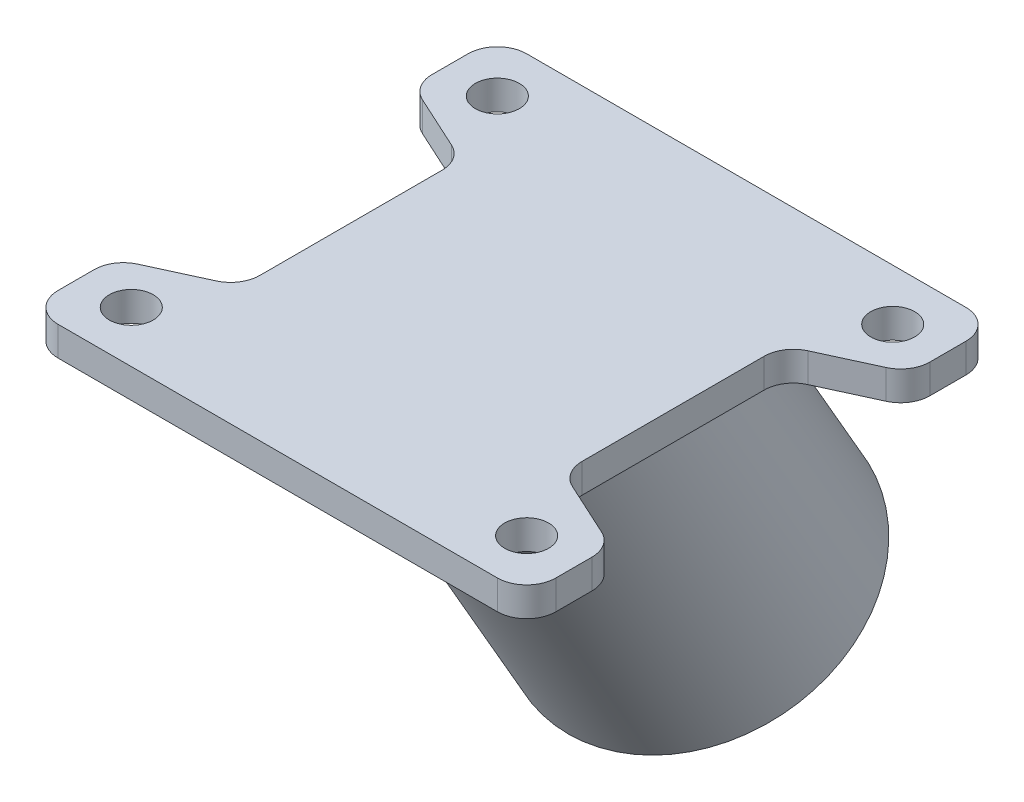
ISO-10303-21;
HEADER;
FILE_DESCRIPTION(('STEP AP214'),'2;1');
FILE_NAME('part.step','',(''),(''),'','','');
FILE_SCHEMA(('AUTOMOTIVE_DESIGN { 1 0 10303 214 1 1 1 1 }'));
ENDSEC;
DATA;
#1=APPLICATION_CONTEXT('core data for automotive mechanical design processes');
#2=APPLICATION_PROTOCOL_DEFINITION('international standard','automotive_design',2000,#1);
#3=PRODUCT_CONTEXT('',#1,'mechanical');
#4=PRODUCT('Part','Part','',(#3));
#5=PRODUCT_RELATED_PRODUCT_CATEGORY('part','',(#4));
#6=PRODUCT_DEFINITION_FORMATION('','',#4);
#7=PRODUCT_DEFINITION_CONTEXT('part definition',#1,'design');
#8=PRODUCT_DEFINITION('design','',#6,#7);
#9=PRODUCT_DEFINITION_SHAPE('','',#8);
#10=(LENGTH_UNIT() NAMED_UNIT(*) SI_UNIT(.MILLI.,.METRE.));
#11=(NAMED_UNIT(*) PLANE_ANGLE_UNIT() SI_UNIT($,.RADIAN.));
#12=(NAMED_UNIT(*) SI_UNIT($,.STERADIAN.) SOLID_ANGLE_UNIT());
#13=UNCERTAINTY_MEASURE_WITH_UNIT(LENGTH_MEASURE(1.E-05),#10,'distance_accuracy_value','');
#14=(GEOMETRIC_REPRESENTATION_CONTEXT(3) GLOBAL_UNCERTAINTY_ASSIGNED_CONTEXT((#13)) GLOBAL_UNIT_ASSIGNED_CONTEXT((#10,
#11,#12)) REPRESENTATION_CONTEXT('',''));
#15=CARTESIAN_POINT('',(0.,0.,0.));
#16=DIRECTION('',(0.,0.,1.));
#17=DIRECTION('',(1.,0.,0.));
#18=AXIS2_PLACEMENT_3D('',#15,#16,#17);
#19=CARTESIAN_POINT('',(-8.096,0.,8.19375502));
#20=DIRECTION('',(0.,-1.,0.));
#21=DIRECTION('',(0.,0.,-1.));
#22=AXIS2_PLACEMENT_3D('',#19,#20,#21);
#23=PLANE('',#22);
#24=CARTESIAN_POINT('',(0.,0.,-1.15470053859501));
#25=DIRECTION('',(0.,-1.,0.));
#26=DIRECTION('',(0.,0.,-1.));
#27=AXIS2_PLACEMENT_3D('',#24,#25,#26);
#28=ELLIPSE('',#27,9.23760430686141,7.99999999985182);
#29=CARTESIAN_POINT('',(0.,0.,-10.3923048454564));
#30=VERTEX_POINT('',#29);
#31=EDGE_CURVE('E20',#30,#30,#28,.T.);
#32=ORIENTED_EDGE('',*,*,#31,.T.);
#33=EDGE_LOOP('',(#32));
#34=FACE_BOUND('',#33,.T.);
#35=ADVANCED_FACE('F17',(#34),#23,.T.);
#36=CARTESIAN_POINT('',(0.,4.14190381084333,1.23662874155137));
#37=DIRECTION('',(0.,-0.866025403784579,-0.499999999999757));
#38=DIRECTION('',(0.,0.499999999999757,-0.866025403784579));
#39=AXIS2_PLACEMENT_3D('',#36,#37,#38);
#40=CYLINDRICAL_SURFACE('',#39,7.99999999985182);
#41=ORIENTED_EDGE('',*,*,#31,.F.);
#42=EDGE_LOOP('',(#41));
#43=FACE_BOUND('',#42,.T.);
#44=CARTESIAN_POINT('',(0.,-19.6506350946913,-12.5000000002548));
#45=DIRECTION('',(0.,-0.866025403784579,-0.499999999999757));
#46=DIRECTION('',(0.,0.499999999999757,-0.866025403784579));
#47=AXIS2_PLACEMENT_3D('',#44,#45,#46);
#48=CIRCLE('',#47,7.99999999985182);
#49=CARTESIAN_POINT('',(0.,-15.6506350947673,-19.4282032304031));
#50=VERTEX_POINT('',#49);
#51=EDGE_CURVE('E350',#50,#50,#48,.T.);
#52=ORIENTED_EDGE('',*,*,#51,.T.);
#53=EDGE_LOOP('',(#52));
#54=FACE_BOUND('',#53,.T.);
#55=ADVANCED_FACE('F358',(#43,#54),#40,.F.);
#56=CARTESIAN_POINT('',(-10.12,-14.590635095,-21.264177086));
#57=DIRECTION('',(0.,0.866025403777064,0.500000000012773));
#58=DIRECTION('',(0.,-0.500000000012773,0.866025403777064));
#59=AXIS2_PLACEMENT_3D('',#56,#57,#58);
#60=PLANE('',#59);
#61=CARTESIAN_POINT('',(0.,-19.6506350948775,-12.5000000003623));
#62=DIRECTION('',(0.,-0.866025403784579,-0.499999999999757));
#63=DIRECTION('',(0.,0.499999999999757,-0.866025403784579));
#64=AXIS2_PLACEMENT_3D('',#61,#62,#63);
#65=CIRCLE('',#64,9.99999999970747);
#66=CARTESIAN_POINT('',(0.,-14.6506350950262,-21.1602540379547));
#67=VERTEX_POINT('',#66);
#68=EDGE_CURVE('E348',#67,#67,#65,.F.);
#69=ORIENTED_EDGE('',*,*,#68,.F.);
#70=EDGE_LOOP('',(#69));
#71=FACE_BOUND('',#70,.T.);
#72=ORIENTED_EDGE('',*,*,#51,.F.);
#73=EDGE_LOOP('',(#72));
#74=FACE_BOUND('',#73,.T.);
#75=ADVANCED_FACE('F360',(#71,#74),#60,.F.);
#76=CARTESIAN_POINT('',(0.,5.14790381117485,1.81744311254716));
#77=DIRECTION('',(0.,-0.866025403784579,-0.499999999999757));
#78=DIRECTION('',(0.,0.499999999999757,-0.866025403784579));
#79=AXIS2_PLACEMENT_3D('',#76,#77,#78);
#80=CYLINDRICAL_SURFACE('',#79,9.99999999970747);
#81=ORIENTED_EDGE('',*,*,#68,.T.);
#82=EDGE_LOOP('',(#81));
#83=FACE_BOUND('',#82,.T.);
#84=CARTESIAN_POINT('',(0.,0.,-1.15470053859501));
#85=DIRECTION('',(0.,-1.,0.));
#86=DIRECTION('',(0.,0.,-1.));
#87=AXIS2_PLACEMENT_3D('',#84,#85,#86);
#88=ELLIPSE('',#87,11.5470053834529,9.99999999970747);
#89=CARTESIAN_POINT('',(0.,0.,-12.7017059220479));
#90=VERTEX_POINT('',#89);
#91=EDGE_CURVE('E345',#90,#90,#88,.F.);
#92=ORIENTED_EDGE('',*,*,#91,.F.);
#93=EDGE_LOOP('',(#92));
#94=FACE_BOUND('',#93,.T.);
#95=ADVANCED_FACE('F366',(#83,#94),#80,.T.);
#96=CARTESIAN_POINT('',(-17.,0.,16.));
#97=DIRECTION('',(0.,-1.,0.));
#98=DIRECTION('',(0.,0.,-1.));
#99=AXIS2_PLACEMENT_3D('',#96,#97,#98);
#100=PLANE('',#99);
#101=CARTESIAN_POINT('',(-13.,0.,-6.217797887));
#102=DIRECTION('',(0.,-1.,0.));
#103=DIRECTION('',(0.,0.,-1.));
#104=AXIS2_PLACEMENT_3D('',#101,#102,#103);
#105=CIRCLE('',#104,2.);
#106=CARTESIAN_POINT('',(-11.,0.,-6.21779788689745));
#107=VERTEX_POINT('',#106);
#108=CARTESIAN_POINT('',(-12.1651523409214,0.,-8.03522171934197));
#109=VERTEX_POINT('',#108);
#110=EDGE_CURVE('E211',#107,#109,#105,.F.);
#111=ORIENTED_EDGE('',*,*,#110,.T.);
#112=DIRECTION('',(0.908711915516898,0.,0.417423830893266));
#113=VECTOR('',#112,1.);
#114=CARTESIAN_POINT('',(-15.834847662,0.,-9.720924584));
#115=LINE('',#114,#113);
#116=CARTESIAN_POINT('',(-15.8348476591968,0.,-9.72092458274447));
#117=VERTEX_POINT('',#116);
#118=EDGE_CURVE('E208',#117,#109,#115,.T.);
#119=ORIENTED_EDGE('',*,*,#118,.F.);
#120=CARTESIAN_POINT('',(-15.,0.,-11.538348415));
#121=DIRECTION('',(0.,-1.,0.));
#122=DIRECTION('',(0.,0.,-1.));
#123=AXIS2_PLACEMENT_3D('',#120,#121,#122);
#124=CIRCLE('',#123,2.);
#125=CARTESIAN_POINT('',(-17.,0.,-11.538348415));
#126=VERTEX_POINT('',#125);
#127=EDGE_CURVE('E303',#126,#117,#124,.F.);
#128=ORIENTED_EDGE('',*,*,#127,.F.);
#129=DIRECTION('',(0.,0.,1.));
#130=VECTOR('',#129,1.);
#131=CARTESIAN_POINT('',(-17.,0.,-14.));
#132=LINE('',#131,#130);
#133=CARTESIAN_POINT('',(-17.,0.,-14.));
#134=VERTEX_POINT('',#133);
#135=EDGE_CURVE('E192',#134,#126,#132,.T.);
#136=ORIENTED_EDGE('',*,*,#135,.F.);
#137=CARTESIAN_POINT('',(-15.,0.,-14.));
#138=DIRECTION('',(0.,-1.,0.));
#139=DIRECTION('',(0.,0.,-1.));
#140=AXIS2_PLACEMENT_3D('',#137,#138,#139);
#141=CIRCLE('',#140,2.);
#142=CARTESIAN_POINT('',(-15.,0.,-16.));
#143=VERTEX_POINT('',#142);
#144=EDGE_CURVE('E184',#143,#134,#141,.F.);
#145=ORIENTED_EDGE('',*,*,#144,.F.);
#146=DIRECTION('',(-1.,0.,0.));
#147=VECTOR('',#146,1.);
#148=CARTESIAN_POINT('',(15.,0.,-16.));
#149=LINE('',#148,#147);
#150=CARTESIAN_POINT('',(15.,0.,-16.));
#151=VERTEX_POINT('',#150);
#152=EDGE_CURVE('E173',#151,#143,#149,.T.);
#153=ORIENTED_EDGE('',*,*,#152,.F.);
#154=CARTESIAN_POINT('',(15.,0.,-14.));
#155=DIRECTION('',(0.,-1.,0.));
#156=DIRECTION('',(0.,0.,-1.));
#157=AXIS2_PLACEMENT_3D('',#154,#155,#156);
#158=CIRCLE('',#157,2.);
#159=CARTESIAN_POINT('',(17.,0.,-14.));
#160=VERTEX_POINT('',#159);
#161=EDGE_CURVE('E202',#160,#151,#158,.F.);
#162=ORIENTED_EDGE('',*,*,#161,.F.);
#163=DIRECTION('',(0.,0.,1.));
#164=VECTOR('',#163,1.);
#165=CARTESIAN_POINT('',(17.,0.,-14.));
#166=LINE('',#165,#164);
#167=CARTESIAN_POINT('',(17.,0.,-11.5383484148974));
#168=VERTEX_POINT('',#167);
#169=EDGE_CURVE('E244',#160,#168,#166,.T.);
#170=ORIENTED_EDGE('',*,*,#169,.T.);
#171=CARTESIAN_POINT('',(15.,0.,-11.538348415));
#172=DIRECTION('',(0.,-1.,0.));
#173=DIRECTION('',(0.,0.,-1.));
#174=AXIS2_PLACEMENT_3D('',#171,#172,#173);
#175=CIRCLE('',#174,2.);
#176=CARTESIAN_POINT('',(15.8348476618582,0.,-9.72092458393485));
#177=VERTEX_POINT('',#176);
#178=EDGE_CURVE('E243',#177,#168,#175,.F.);
#179=ORIENTED_EDGE('',*,*,#178,.F.);
#180=DIRECTION('',(-0.908711915516898,0.,0.417423830893266));
#181=VECTOR('',#180,1.);
#182=CARTESIAN_POINT('',(15.834847662,0.,-9.720924584));
#183=LINE('',#182,#181);
#184=CARTESIAN_POINT('',(12.1651523381284,0.,-8.03522171802683));
#185=VERTEX_POINT('',#184);
#186=EDGE_CURVE('E240',#177,#185,#183,.T.);
#187=ORIENTED_EDGE('',*,*,#186,.T.);
#188=CARTESIAN_POINT('',(13.,0.,-6.217797887));
#189=DIRECTION('',(0.,-1.,0.));
#190=DIRECTION('',(0.,0.,-1.));
#191=AXIS2_PLACEMENT_3D('',#188,#189,#190);
#192=CIRCLE('',#191,2.);
#193=CARTESIAN_POINT('',(11.,0.,-6.217797887));
#194=VERTEX_POINT('',#193);
#195=EDGE_CURVE('E239',#185,#194,#192,.F.);
#196=ORIENTED_EDGE('',*,*,#195,.T.);
#197=DIRECTION('',(0.,0.,-1.));
#198=VECTOR('',#197,1.);
#199=CARTESIAN_POINT('',(11.,0.,6.217797887));
#200=LINE('',#199,#198);
#201=CARTESIAN_POINT('',(11.,0.,6.21779788719234));
#202=VERTEX_POINT('',#201);
#203=EDGE_CURVE('E236',#202,#194,#200,.T.);
#204=ORIENTED_EDGE('',*,*,#203,.F.);
#205=CARTESIAN_POINT('',(13.,0.,6.217797887));
#206=DIRECTION('',(0.,-1.,0.));
#207=DIRECTION('',(0.,0.,-1.));
#208=AXIS2_PLACEMENT_3D('',#205,#206,#207);
#209=CIRCLE('',#208,2.);
#210=CARTESIAN_POINT('',(12.1651523409214,0.,8.03522171934197));
#211=VERTEX_POINT('',#210);
#212=EDGE_CURVE('E235',#202,#211,#209,.F.);
#213=ORIENTED_EDGE('',*,*,#212,.T.);
#214=DIRECTION('',(-0.908711915516898,0.,-0.417423830893266));
#215=VECTOR('',#214,1.);
#216=CARTESIAN_POINT('',(15.834847662,0.,9.720924584));
#217=LINE('',#216,#215);
#218=CARTESIAN_POINT('',(15.8348476590104,0.,9.72092458265885));
#219=VERTEX_POINT('',#218);
#220=EDGE_CURVE('E232',#219,#211,#217,.T.);
#221=ORIENTED_EDGE('',*,*,#220,.F.);
#222=CARTESIAN_POINT('',(15.,0.,11.538348415));
#223=DIRECTION('',(0.,-1.,0.));
#224=DIRECTION('',(0.,0.,-1.));
#225=AXIS2_PLACEMENT_3D('',#222,#223,#224);
#226=CIRCLE('',#225,2.);
#227=CARTESIAN_POINT('',(17.,0.,11.538348415));
#228=VERTEX_POINT('',#227);
#229=EDGE_CURVE('E231',#228,#219,#226,.F.);
#230=ORIENTED_EDGE('',*,*,#229,.F.);
#231=DIRECTION('',(0.,0.,1.));
#232=VECTOR('',#231,1.);
#233=CARTESIAN_POINT('',(17.,0.,11.538348415));
#234=LINE('',#233,#232);
#235=CARTESIAN_POINT('',(17.,0.,14.0000000001026));
#236=VERTEX_POINT('',#235);
#237=EDGE_CURVE('E228',#228,#236,#234,.T.);
#238=ORIENTED_EDGE('',*,*,#237,.T.);
#239=CARTESIAN_POINT('',(15.,0.,14.));
#240=DIRECTION('',(0.,-1.,0.));
#241=DIRECTION('',(0.,0.,-1.));
#242=AXIS2_PLACEMENT_3D('',#239,#240,#241);
#243=CIRCLE('',#242,2.);
#244=CARTESIAN_POINT('',(15.,0.,16.));
#245=VERTEX_POINT('',#244);
#246=EDGE_CURVE('E227',#245,#236,#243,.F.);
#247=ORIENTED_EDGE('',*,*,#246,.F.);
#248=DIRECTION('',(-1.,0.,0.));
#249=VECTOR('',#248,1.);
#250=CARTESIAN_POINT('',(15.,0.,16.));
#251=LINE('',#250,#249);
#252=CARTESIAN_POINT('',(-15.0000000002051,0.,16.));
#253=VERTEX_POINT('',#252);
#254=EDGE_CURVE('E224',#245,#253,#251,.T.);
#255=ORIENTED_EDGE('',*,*,#254,.T.);
#256=CARTESIAN_POINT('',(-15.,0.,14.));
#257=DIRECTION('',(0.,-1.,0.));
#258=DIRECTION('',(0.,0.,-1.));
#259=AXIS2_PLACEMENT_3D('',#256,#257,#258);
#260=CIRCLE('',#259,2.);
#261=CARTESIAN_POINT('',(-17.,0.,14.));
#262=VERTEX_POINT('',#261);
#263=EDGE_CURVE('E223',#262,#253,#260,.F.);
#264=ORIENTED_EDGE('',*,*,#263,.F.);
#265=DIRECTION('',(0.,0.,1.));
#266=VECTOR('',#265,1.);
#267=CARTESIAN_POINT('',(-17.,0.,11.538348415));
#268=LINE('',#267,#266);
#269=CARTESIAN_POINT('',(-17.,0.,11.5383484151923));
#270=VERTEX_POINT('',#269);
#271=EDGE_CURVE('E220',#270,#262,#268,.T.);
#272=ORIENTED_EDGE('',*,*,#271,.F.);
#273=CARTESIAN_POINT('',(-15.,0.,11.538348415));
#274=DIRECTION('',(0.,-1.,0.));
#275=DIRECTION('',(0.,0.,-1.));
#276=AXIS2_PLACEMENT_3D('',#273,#274,#275);
#277=CIRCLE('',#276,2.);
#278=CARTESIAN_POINT('',(-15.8348476618582,0.,9.72092458393485));
#279=VERTEX_POINT('',#278);
#280=EDGE_CURVE('E219',#279,#270,#277,.F.);
#281=ORIENTED_EDGE('',*,*,#280,.F.);
#282=DIRECTION('',(0.908711915516898,0.,-0.417423830893266));
#283=VECTOR('',#282,1.);
#284=CARTESIAN_POINT('',(-15.834847662,0.,9.720924584));
#285=LINE('',#284,#283);
#286=CARTESIAN_POINT('',(-12.165152337942,0.,8.03522171794122));
#287=VERTEX_POINT('',#286);
#288=EDGE_CURVE('E216',#279,#287,#285,.T.);
#289=ORIENTED_EDGE('',*,*,#288,.T.);
#290=CARTESIAN_POINT('',(-13.,0.,6.217797887));
#291=DIRECTION('',(0.,-1.,0.));
#292=DIRECTION('',(0.,0.,-1.));
#293=AXIS2_PLACEMENT_3D('',#290,#291,#292);
#294=CIRCLE('',#293,2.);
#295=CARTESIAN_POINT('',(-11.,0.,6.217797887));
#296=VERTEX_POINT('',#295);
#297=EDGE_CURVE('E215',#287,#296,#294,.F.);
#298=ORIENTED_EDGE('',*,*,#297,.T.);
#299=DIRECTION('',(0.,0.,-1.));
#300=VECTOR('',#299,1.);
#301=CARTESIAN_POINT('',(-11.,0.,6.217797887));
#302=LINE('',#301,#300);
#303=EDGE_CURVE('E212',#296,#107,#302,.T.);
#304=ORIENTED_EDGE('',*,*,#303,.T.);
#305=EDGE_LOOP('',(#111,#119,#128,#136,#145,#153,#162,#170,#179,#187,#196,#204,#213,#221,#230,
#238,#247,#255,#264,#272,#281,#289,#298,#304));
#306=FACE_BOUND('',#305,.T.);
#307=CARTESIAN_POINT('',(-13.5,0.,12.5));
#308=DIRECTION('',(0.,-1.,0.));
#309=DIRECTION('',(0.,0.,-1.));
#310=AXIS2_PLACEMENT_3D('',#307,#308,#309);
#311=CIRCLE('',#310,1.5);
#312=CARTESIAN_POINT('',(-13.5,0.,11.));
#313=VERTEX_POINT('',#312);
#314=EDGE_CURVE('E196',#313,#313,#311,.F.);
#315=ORIENTED_EDGE('',*,*,#314,.T.);
#316=EDGE_LOOP('',(#315));
#317=FACE_BOUND('',#316,.T.);
#318=CARTESIAN_POINT('',(13.5,0.,12.5));
#319=DIRECTION('',(0.,-1.,0.));
#320=DIRECTION('',(0.,0.,-1.));
#321=AXIS2_PLACEMENT_3D('',#318,#319,#320);
#322=CIRCLE('',#321,1.5);
#323=CARTESIAN_POINT('',(13.5,0.,11.));
#324=VERTEX_POINT('',#323);
#325=EDGE_CURVE('E336',#324,#324,#322,.F.);
#326=ORIENTED_EDGE('',*,*,#325,.T.);
#327=EDGE_LOOP('',(#326));
#328=FACE_BOUND('',#327,.T.);
#329=CARTESIAN_POINT('',(-13.5,0.,-12.5));
#330=DIRECTION('',(0.,-1.,0.));
#331=DIRECTION('',(0.,0.,-1.));
#332=AXIS2_PLACEMENT_3D('',#329,#330,#331);
#333=CIRCLE('',#332,1.5);
#334=CARTESIAN_POINT('',(-13.5,0.,-14.));
#335=VERTEX_POINT('',#334);
#336=EDGE_CURVE('E339',#335,#335,#333,.F.);
#337=ORIENTED_EDGE('',*,*,#336,.T.);
#338=EDGE_LOOP('',(#337));
#339=FACE_BOUND('',#338,.T.);
#340=CARTESIAN_POINT('',(13.5,0.,-12.5));
#341=DIRECTION('',(0.,-1.,0.));
#342=DIRECTION('',(0.,0.,-1.));
#343=AXIS2_PLACEMENT_3D('',#340,#341,#342);
#344=CIRCLE('',#343,1.5);
#345=CARTESIAN_POINT('',(13.5,0.,-14.));
#346=VERTEX_POINT('',#345);
#347=EDGE_CURVE('E342',#346,#346,#344,.F.);
#348=ORIENTED_EDGE('',*,*,#347,.T.);
#349=EDGE_LOOP('',(#348));
#350=FACE_BOUND('',#349,.T.);
#351=ORIENTED_EDGE('',*,*,#91,.T.);
#352=EDGE_LOOP('',(#351));
#353=FACE_BOUND('',#352,.T.);
#354=ADVANCED_FACE('F189',(#306,#317,#328,#339,#350,#353),#100,.T.);
#355=CARTESIAN_POINT('',(13.5,2.,-12.5));
#356=DIRECTION('',(0.,-1.,0.));
#357=DIRECTION('',(0.,0.,-1.));
#358=AXIS2_PLACEMENT_3D('',#355,#356,#357);
#359=CYLINDRICAL_SURFACE('',#358,1.5);
#360=ORIENTED_EDGE('',*,*,#347,.F.);
#361=EDGE_LOOP('',(#360));
#362=FACE_BOUND('',#361,.T.);
#363=CARTESIAN_POINT('',(13.5,2.,-12.5));
#364=DIRECTION('',(0.,-1.,0.));
#365=DIRECTION('',(0.,0.,-1.));
#366=AXIS2_PLACEMENT_3D('',#363,#364,#365);
#367=CIRCLE('',#366,1.5);
#368=CARTESIAN_POINT('',(13.5,2.,-14.));
#369=VERTEX_POINT('',#368);
#370=EDGE_CURVE('E300',#369,#369,#367,.F.);
#371=ORIENTED_EDGE('',*,*,#370,.T.);
#372=EDGE_LOOP('',(#371));
#373=FACE_BOUND('',#372,.T.);
#374=ADVANCED_FACE('F481',(#362,#373),#359,.F.);
#375=CARTESIAN_POINT('',(-13.5,2.,-12.5));
#376=DIRECTION('',(0.,-1.,0.));
#377=DIRECTION('',(0.,0.,-1.));
#378=AXIS2_PLACEMENT_3D('',#375,#376,#377);
#379=CYLINDRICAL_SURFACE('',#378,1.5);
#380=ORIENTED_EDGE('',*,*,#336,.F.);
#381=EDGE_LOOP('',(#380));
#382=FACE_BOUND('',#381,.T.);
#383=CARTESIAN_POINT('',(-13.5,2.,-12.5));
#384=DIRECTION('',(0.,-1.,0.));
#385=DIRECTION('',(0.,0.,-1.));
#386=AXIS2_PLACEMENT_3D('',#383,#384,#385);
#387=CIRCLE('',#386,1.5);
#388=CARTESIAN_POINT('',(-13.5,2.,-14.));
#389=VERTEX_POINT('',#388);
#390=EDGE_CURVE('E297',#389,#389,#387,.F.);
#391=ORIENTED_EDGE('',*,*,#390,.T.);
#392=EDGE_LOOP('',(#391));
#393=FACE_BOUND('',#392,.T.);
#394=ADVANCED_FACE('F477',(#382,#393),#379,.F.);
#395=CARTESIAN_POINT('',(13.5,2.,12.5));
#396=DIRECTION('',(0.,-1.,0.));
#397=DIRECTION('',(0.,0.,-1.));
#398=AXIS2_PLACEMENT_3D('',#395,#396,#397);
#399=CYLINDRICAL_SURFACE('',#398,1.5);
#400=ORIENTED_EDGE('',*,*,#325,.F.);
#401=EDGE_LOOP('',(#400));
#402=FACE_BOUND('',#401,.T.);
#403=CARTESIAN_POINT('',(13.5,2.,12.5));
#404=DIRECTION('',(0.,-1.,0.));
#405=DIRECTION('',(0.,0.,-1.));
#406=AXIS2_PLACEMENT_3D('',#403,#404,#405);
#407=CIRCLE('',#406,1.5);
#408=CARTESIAN_POINT('',(13.5,2.,11.));
#409=VERTEX_POINT('',#408);
#410=EDGE_CURVE('E294',#409,#409,#407,.F.);
#411=ORIENTED_EDGE('',*,*,#410,.T.);
#412=EDGE_LOOP('',(#411));
#413=FACE_BOUND('',#412,.T.);
#414=ADVANCED_FACE('F473',(#402,#413),#399,.F.);
#415=CARTESIAN_POINT('',(-13.5,2.,12.5));
#416=DIRECTION('',(0.,-1.,0.));
#417=DIRECTION('',(0.,0.,-1.));
#418=AXIS2_PLACEMENT_3D('',#415,#416,#417);
#419=CYLINDRICAL_SURFACE('',#418,1.5);
#420=ORIENTED_EDGE('',*,*,#314,.F.);
#421=EDGE_LOOP('',(#420));
#422=FACE_BOUND('',#421,.T.);
#423=CARTESIAN_POINT('',(-13.5,2.,12.5));
#424=DIRECTION('',(0.,-1.,0.));
#425=DIRECTION('',(0.,0.,-1.));
#426=AXIS2_PLACEMENT_3D('',#423,#424,#425);
#427=CIRCLE('',#426,1.5);
#428=CARTESIAN_POINT('',(-13.5,2.,11.));
#429=VERTEX_POINT('',#428);
#430=EDGE_CURVE('E291',#429,#429,#427,.F.);
#431=ORIENTED_EDGE('',*,*,#430,.T.);
#432=EDGE_LOOP('',(#431));
#433=FACE_BOUND('',#432,.T.);
#434=ADVANCED_FACE('F470',(#422,#433),#419,.F.);
#435=CARTESIAN_POINT('',(-15.,2.,-14.));
#436=DIRECTION('',(0.,-1.,0.));
#437=DIRECTION('',(0.,0.,-1.));
#438=AXIS2_PLACEMENT_3D('',#435,#436,#437);
#439=CYLINDRICAL_SURFACE('',#438,2.);
#440=DIRECTION('',(0.,1.,0.));
#441=VECTOR('',#440,1.);
#442=CARTESIAN_POINT('',(-15.,0.,-16.));
#443=LINE('',#442,#441);
#444=CARTESIAN_POINT('',(-15.,2.,-16.));
#445=VERTEX_POINT('',#444);
#446=EDGE_CURVE('E178',#143,#445,#443,.T.);
#447=ORIENTED_EDGE('',*,*,#446,.F.);
#448=ORIENTED_EDGE('',*,*,#144,.T.);
#449=DIRECTION('',(0.,1.,0.));
#450=VECTOR('',#449,1.);
#451=CARTESIAN_POINT('',(-17.,0.,-14.));
#452=LINE('',#451,#450);
#453=CARTESIAN_POINT('',(-17.,2.,-14.));
#454=VERTEX_POINT('',#453);
#455=EDGE_CURVE('E207',#454,#134,#452,.F.);
#456=ORIENTED_EDGE('',*,*,#455,.F.);
#457=CARTESIAN_POINT('',(-15.,2.,-14.));
#458=DIRECTION('',(0.,-1.,0.));
#459=DIRECTION('',(0.,0.,-1.));
#460=AXIS2_PLACEMENT_3D('',#457,#458,#459);
#461=CIRCLE('',#460,2.);
#462=EDGE_CURVE('E200',#454,#445,#461,.T.);
#463=ORIENTED_EDGE('',*,*,#462,.T.);
#464=EDGE_LOOP('',(#447,#448,#456,#463));
#465=FACE_BOUND('',#464,.T.);
#466=ADVANCED_FACE('F199',(#465),#439,.T.);
#467=CARTESIAN_POINT('',(15.,0.,-16.));
#468=DIRECTION('',(0.,0.,-1.));
#469=DIRECTION('',(-1.,0.,0.));
#470=AXIS2_PLACEMENT_3D('',#467,#468,#469);
#471=PLANE('',#470);
#472=ORIENTED_EDGE('',*,*,#152,.T.);
#473=ORIENTED_EDGE('',*,*,#446,.T.);
#474=DIRECTION('',(1.,0.,0.));
#475=VECTOR('',#474,1.);
#476=CARTESIAN_POINT('',(-17.,2.,-16.));
#477=LINE('',#476,#475);
#478=CARTESIAN_POINT('',(15.,2.,-16.));
#479=VERTEX_POINT('',#478);
#480=EDGE_CURVE('E289',#445,#479,#477,.T.);
#481=ORIENTED_EDGE('',*,*,#480,.T.);
#482=DIRECTION('',(0.,-1.,0.));
#483=VECTOR('',#482,1.);
#484=CARTESIAN_POINT('',(15.,2.,-16.));
#485=LINE('',#484,#483);
#486=EDGE_CURVE('E180',#151,#479,#485,.F.);
#487=ORIENTED_EDGE('',*,*,#486,.F.);
#488=EDGE_LOOP('',(#472,#473,#481,#487));
#489=FACE_BOUND('',#488,.T.);
#490=ADVANCED_FACE('F175',(#489),#471,.T.);
#491=CARTESIAN_POINT('',(15.,2.,-14.));
#492=DIRECTION('',(0.,-1.,0.));
#493=DIRECTION('',(0.,0.,-1.));
#494=AXIS2_PLACEMENT_3D('',#491,#492,#493);
#495=CYLINDRICAL_SURFACE('',#494,2.);
#496=DIRECTION('',(0.,1.,0.));
#497=VECTOR('',#496,1.);
#498=CARTESIAN_POINT('',(17.,0.,-14.));
#499=LINE('',#498,#497);
#500=CARTESIAN_POINT('',(17.,2.,-14.));
#501=VERTEX_POINT('',#500);
#502=EDGE_CURVE('E245',#501,#160,#499,.F.);
#503=ORIENTED_EDGE('',*,*,#502,.T.);
#504=ORIENTED_EDGE('',*,*,#161,.T.);
#505=ORIENTED_EDGE('',*,*,#486,.T.);
#506=CARTESIAN_POINT('',(15.,2.,-14.));
#507=DIRECTION('',(0.,-1.,0.));
#508=DIRECTION('',(0.,0.,-1.));
#509=AXIS2_PLACEMENT_3D('',#506,#507,#508);
#510=CIRCLE('',#509,2.);
#511=EDGE_CURVE('E286',#479,#501,#510,.T.);
#512=ORIENTED_EDGE('',*,*,#511,.T.);
#513=EDGE_LOOP('',(#503,#504,#505,#512));
#514=FACE_BOUND('',#513,.T.);
#515=ADVANCED_FACE('F461',(#514),#495,.T.);
#516=CARTESIAN_POINT('',(17.,0.,-14.));
#517=DIRECTION('',(-1.,0.,0.));
#518=DIRECTION('',(0.,0.,1.));
#519=AXIS2_PLACEMENT_3D('',#516,#517,#518);
#520=PLANE('',#519);
#521=DIRECTION('',(0.,0.,-1.));
#522=VECTOR('',#521,1.);
#523=CARTESIAN_POINT('',(17.,2.,16.));
#524=LINE('',#523,#522);
#525=CARTESIAN_POINT('',(17.,2.,-11.5383484148974));
#526=VERTEX_POINT('',#525);
#527=EDGE_CURVE('E285',#501,#526,#524,.F.);
#528=ORIENTED_EDGE('',*,*,#527,.T.);
#529=DIRECTION('',(0.,-1.,0.));
#530=VECTOR('',#529,1.);
#531=CARTESIAN_POINT('',(17.,2.,-11.5383484147949));
#532=LINE('',#531,#530);
#533=EDGE_CURVE('E332',#168,#526,#532,.F.);
#534=ORIENTED_EDGE('',*,*,#533,.F.);
#535=ORIENTED_EDGE('',*,*,#169,.F.);
#536=ORIENTED_EDGE('',*,*,#502,.F.);
#537=EDGE_LOOP('',(#528,#534,#535,#536));
#538=FACE_BOUND('',#537,.T.);
#539=ADVANCED_FACE('F457',(#538),#520,.F.);
#540=CARTESIAN_POINT('',(15.,2.,-11.538348415));
#541=DIRECTION('',(0.,-1.,0.));
#542=DIRECTION('',(0.,0.,-1.));
#543=AXIS2_PLACEMENT_3D('',#540,#541,#542);
#544=CYLINDRICAL_SURFACE('',#543,2.);
#545=DIRECTION('',(0.,1.,0.));
#546=VECTOR('',#545,1.);
#547=CARTESIAN_POINT('',(15.8348476619055,0.,-9.72092458395657));
#548=LINE('',#547,#546);
#549=CARTESIAN_POINT('',(15.8348476618647,2.,-9.72092458393787));
#550=VERTEX_POINT('',#549);
#551=EDGE_CURVE('E242',#550,#177,#548,.F.);
#552=ORIENTED_EDGE('',*,*,#551,.T.);
#553=ORIENTED_EDGE('',*,*,#178,.T.);
#554=ORIENTED_EDGE('',*,*,#533,.T.);
#555=CARTESIAN_POINT('',(15.,2.,-11.538348415));
#556=DIRECTION('',(0.,-1.,0.));
#557=DIRECTION('',(0.,0.,-1.));
#558=AXIS2_PLACEMENT_3D('',#555,#556,#557);
#559=CIRCLE('',#558,2.);
#560=EDGE_CURVE('E282',#526,#550,#559,.T.);
#561=ORIENTED_EDGE('',*,*,#560,.T.);
#562=EDGE_LOOP('',(#552,#553,#554,#561));
#563=FACE_BOUND('',#562,.T.);
#564=ADVANCED_FACE('F453',(#563),#544,.T.);
#565=CARTESIAN_POINT('',(15.834847662,0.,-9.720924584));
#566=DIRECTION('',(-0.417423830893266,0.,-0.908711915516898));
#567=DIRECTION('',(-0.908711915516898,0.,0.417423830893266));
#568=AXIS2_PLACEMENT_3D('',#565,#566,#567);
#569=PLANE('',#568);
#570=DIRECTION('',(-0.90871191551388,0.,0.417423830899837));
#571=VECTOR('',#570,1.);
#572=CARTESIAN_POINT('',(15.8348476619055,2.,-9.72092458395657));
#573=LINE('',#572,#571);
#574=CARTESIAN_POINT('',(12.1651523381279,2.,-8.03522171801055));
#575=VERTEX_POINT('',#574);
#576=EDGE_CURVE('E281',#550,#575,#573,.T.);
#577=ORIENTED_EDGE('',*,*,#576,.T.);
#578=DIRECTION('',(0.,-1.,0.));
#579=VECTOR('',#578,1.);
#580=CARTESIAN_POINT('',(12.1651523380676,2.,-8.0352217179668));
#581=LINE('',#580,#579);
#582=EDGE_CURVE('E329',#575,#185,#581,.T.);
#583=ORIENTED_EDGE('',*,*,#582,.T.);
#584=ORIENTED_EDGE('',*,*,#186,.F.);
#585=ORIENTED_EDGE('',*,*,#551,.F.);
#586=EDGE_LOOP('',(#577,#583,#584,#585));
#587=FACE_BOUND('',#586,.T.);
#588=ADVANCED_FACE('F449',(#587),#569,.F.);
#589=CARTESIAN_POINT('',(13.,2.,-6.217797887));
#590=DIRECTION('',(0.,-1.,0.));
#591=DIRECTION('',(0.,0.,-1.));
#592=AXIS2_PLACEMENT_3D('',#589,#590,#591);
#593=CYLINDRICAL_SURFACE('',#592,2.);
#594=DIRECTION('',(0.,1.,0.));
#595=VECTOR('',#594,1.);
#596=CARTESIAN_POINT('',(11.,0.,-6.217797887));
#597=LINE('',#596,#595);
#598=CARTESIAN_POINT('',(11.000000002,2.,-6.217797887));
#599=VERTEX_POINT('',#598);
#600=EDGE_CURVE('E238',#194,#599,#597,.T.);
#601=ORIENTED_EDGE('',*,*,#600,.F.);
#602=ORIENTED_EDGE('',*,*,#195,.F.);
#603=ORIENTED_EDGE('',*,*,#582,.F.);
#604=CARTESIAN_POINT('',(13.,2.,-6.217797887));
#605=DIRECTION('',(0.,-1.,0.));
#606=DIRECTION('',(0.,0.,-1.));
#607=AXIS2_PLACEMENT_3D('',#604,#605,#606);
#608=CIRCLE('',#607,2.);
#609=EDGE_CURVE('E278',#575,#599,#608,.F.);
#610=ORIENTED_EDGE('',*,*,#609,.T.);
#611=EDGE_LOOP('',(#601,#602,#603,#610));
#612=FACE_BOUND('',#611,.T.);
#613=ADVANCED_FACE('F445',(#612),#593,.F.);
#614=CARTESIAN_POINT('',(11.,0.,6.217797887));
#615=DIRECTION('',(1.,0.,0.));
#616=DIRECTION('',(0.,0.,-1.));
#617=AXIS2_PLACEMENT_3D('',#614,#615,#616);
#618=PLANE('',#617);
#619=ORIENTED_EDGE('',*,*,#203,.T.);
#620=ORIENTED_EDGE('',*,*,#600,.T.);
#621=DIRECTION('',(0.,0.,-1.));
#622=VECTOR('',#621,1.);
#623=CARTESIAN_POINT('',(11.000000004,2.,16.));
#624=LINE('',#623,#622);
#625=CARTESIAN_POINT('',(11.000000002,2.,6.21779788719234));
#626=VERTEX_POINT('',#625);
#627=EDGE_CURVE('E277',#599,#626,#624,.F.);
#628=ORIENTED_EDGE('',*,*,#627,.T.);
#629=DIRECTION('',(0.,-1.,0.));
#630=VECTOR('',#629,1.);
#631=CARTESIAN_POINT('',(11.,2.,6.21779788738469));
#632=LINE('',#631,#630);
#633=EDGE_CURVE('E326',#626,#202,#632,.T.);
#634=ORIENTED_EDGE('',*,*,#633,.T.);
#635=EDGE_LOOP('',(#619,#620,#628,#634));
#636=FACE_BOUND('',#635,.T.);
#637=ADVANCED_FACE('F441',(#636),#618,.T.);
#638=CARTESIAN_POINT('',(13.,2.,6.217797887));
#639=DIRECTION('',(0.,-1.,0.));
#640=DIRECTION('',(0.,0.,-1.));
#641=AXIS2_PLACEMENT_3D('',#638,#639,#640);
#642=CYLINDRICAL_SURFACE('',#641,2.);
#643=DIRECTION('',(0.,1.,0.));
#644=VECTOR('',#643,1.);
#645=CARTESIAN_POINT('',(12.1651523436537,0.,8.03522172059709));
#646=LINE('',#645,#644);
#647=CARTESIAN_POINT('',(12.1651523409149,2.,8.03522171933896));
#648=VERTEX_POINT('',#647);
#649=EDGE_CURVE('E234',#211,#648,#646,.T.);
#650=ORIENTED_EDGE('',*,*,#649,.F.);
#651=ORIENTED_EDGE('',*,*,#212,.F.);
#652=ORIENTED_EDGE('',*,*,#633,.F.);
#653=CARTESIAN_POINT('',(13.,2.,6.217797887));
#654=DIRECTION('',(0.,-1.,0.));
#655=DIRECTION('',(0.,0.,-1.));
#656=AXIS2_PLACEMENT_3D('',#653,#654,#655);
#657=CIRCLE('',#656,2.);
#658=EDGE_CURVE('E274',#626,#648,#657,.F.);
#659=ORIENTED_EDGE('',*,*,#658,.T.);
#660=EDGE_LOOP('',(#650,#651,#652,#659));
#661=FACE_BOUND('',#660,.T.);
#662=ADVANCED_FACE('F437',(#661),#642,.F.);
#663=CARTESIAN_POINT('',(15.834847662,0.,9.720924584));
#664=DIRECTION('',(0.417423830893266,0.,-0.908711915516898));
#665=DIRECTION('',(-0.908711915516898,0.,-0.417423830893266));
#666=AXIS2_PLACEMENT_3D('',#663,#664,#665);
#667=PLANE('',#666);
#668=ORIENTED_EDGE('',*,*,#220,.T.);
#669=ORIENTED_EDGE('',*,*,#649,.T.);
#670=DIRECTION('',(0.90871191551388,0.,0.417423830899836));
#671=VECTOR('',#670,1.);
#672=CARTESIAN_POINT('',(12.1651523380945,2.,8.03522171804343));
#673=LINE('',#672,#671);
#674=CARTESIAN_POINT('',(15.8348476590109,2.,9.72092458267514));
#675=VERTEX_POINT('',#674);
#676=EDGE_CURVE('E273',#648,#675,#673,.T.);
#677=ORIENTED_EDGE('',*,*,#676,.T.);
#678=DIRECTION('',(0.,-1.,0.));
#679=VECTOR('',#678,1.);
#680=CARTESIAN_POINT('',(15.83484765621,2.,9.72092458140457));
#681=LINE('',#680,#679);
#682=EDGE_CURVE('E323',#219,#675,#681,.F.);
#683=ORIENTED_EDGE('',*,*,#682,.F.);
#684=EDGE_LOOP('',(#668,#669,#677,#683));
#685=FACE_BOUND('',#684,.T.);
#686=ADVANCED_FACE('F433',(#685),#667,.T.);
#687=CARTESIAN_POINT('',(15.,2.,11.538348415));
#688=DIRECTION('',(0.,-1.,0.));
#689=DIRECTION('',(0.,0.,-1.));
#690=AXIS2_PLACEMENT_3D('',#687,#688,#689);
#691=CYLINDRICAL_SURFACE('',#690,2.);
#692=DIRECTION('',(0.,1.,0.));
#693=VECTOR('',#692,1.);
#694=CARTESIAN_POINT('',(17.,0.,11.538348415));
#695=LINE('',#694,#693);
#696=CARTESIAN_POINT('',(17.,2.,11.538348415));
#697=VERTEX_POINT('',#696);
#698=EDGE_CURVE('E230',#697,#228,#695,.F.);
#699=ORIENTED_EDGE('',*,*,#698,.T.);
#700=ORIENTED_EDGE('',*,*,#229,.T.);
#701=ORIENTED_EDGE('',*,*,#682,.T.);
#702=CARTESIAN_POINT('',(15.,2.,11.538348415));
#703=DIRECTION('',(0.,-1.,0.));
#704=DIRECTION('',(0.,0.,-1.));
#705=AXIS2_PLACEMENT_3D('',#702,#703,#704);
#706=CIRCLE('',#705,2.);
#707=EDGE_CURVE('E270',#675,#697,#706,.T.);
#708=ORIENTED_EDGE('',*,*,#707,.T.);
#709=EDGE_LOOP('',(#699,#700,#701,#708));
#710=FACE_BOUND('',#709,.T.);
#711=ADVANCED_FACE('F429',(#710),#691,.T.);
#712=CARTESIAN_POINT('',(17.,0.,11.538348415));
#713=DIRECTION('',(-1.,0.,0.));
#714=DIRECTION('',(0.,0.,1.));
#715=AXIS2_PLACEMENT_3D('',#712,#713,#714);
#716=PLANE('',#715);
#717=DIRECTION('',(0.,0.,-1.));
#718=VECTOR('',#717,1.);
#719=CARTESIAN_POINT('',(17.,2.,16.));
#720=LINE('',#719,#718);
#721=CARTESIAN_POINT('',(17.,2.,14.0000000001026));
#722=VERTEX_POINT('',#721);
#723=EDGE_CURVE('E269',#697,#722,#720,.F.);
#724=ORIENTED_EDGE('',*,*,#723,.T.);
#725=DIRECTION('',(0.,-1.,0.));
#726=VECTOR('',#725,1.);
#727=CARTESIAN_POINT('',(17.,2.,14.0000000002051));
#728=LINE('',#727,#726);
#729=EDGE_CURVE('E320',#236,#722,#728,.F.);
#730=ORIENTED_EDGE('',*,*,#729,.F.);
#731=ORIENTED_EDGE('',*,*,#237,.F.);
#732=ORIENTED_EDGE('',*,*,#698,.F.);
#733=EDGE_LOOP('',(#724,#730,#731,#732));
#734=FACE_BOUND('',#733,.T.);
#735=ADVANCED_FACE('F425',(#734),#716,.F.);
#736=CARTESIAN_POINT('',(15.,2.,14.));
#737=DIRECTION('',(0.,-1.,0.));
#738=DIRECTION('',(0.,0.,-1.));
#739=AXIS2_PLACEMENT_3D('',#736,#737,#738);
#740=CYLINDRICAL_SURFACE('',#739,2.);
#741=DIRECTION('',(0.,1.,0.));
#742=VECTOR('',#741,1.);
#743=CARTESIAN_POINT('',(15.,0.,16.));
#744=LINE('',#743,#742);
#745=CARTESIAN_POINT('',(15.,2.,16.));
#746=VERTEX_POINT('',#745);
#747=EDGE_CURVE('E226',#746,#245,#744,.F.);
#748=ORIENTED_EDGE('',*,*,#747,.T.);
#749=ORIENTED_EDGE('',*,*,#246,.T.);
#750=ORIENTED_EDGE('',*,*,#729,.T.);
#751=CARTESIAN_POINT('',(15.,2.,14.));
#752=DIRECTION('',(0.,-1.,0.));
#753=DIRECTION('',(0.,0.,-1.));
#754=AXIS2_PLACEMENT_3D('',#751,#752,#753);
#755=CIRCLE('',#754,2.);
#756=EDGE_CURVE('E266',#722,#746,#755,.T.);
#757=ORIENTED_EDGE('',*,*,#756,.T.);
#758=EDGE_LOOP('',(#748,#749,#750,#757));
#759=FACE_BOUND('',#758,.T.);
#760=ADVANCED_FACE('F421',(#759),#740,.T.);
#761=CARTESIAN_POINT('',(15.,0.,16.));
#762=DIRECTION('',(0.,0.,-1.));
#763=DIRECTION('',(-1.,0.,0.));
#764=AXIS2_PLACEMENT_3D('',#761,#762,#763);
#765=PLANE('',#764);
#766=DIRECTION('',(1.,0.,0.));
#767=VECTOR('',#766,1.);
#768=CARTESIAN_POINT('',(-17.,2.,16.));
#769=LINE('',#768,#767);
#770=CARTESIAN_POINT('',(-15.0000000002051,2.,16.));
#771=VERTEX_POINT('',#770);
#772=EDGE_CURVE('E265',#746,#771,#769,.F.);
#773=ORIENTED_EDGE('',*,*,#772,.T.);
#774=DIRECTION('',(0.,-1.,0.));
#775=VECTOR('',#774,1.);
#776=CARTESIAN_POINT('',(-15.0000000004102,2.,16.));
#777=LINE('',#776,#775);
#778=EDGE_CURVE('E317',#253,#771,#777,.F.);
#779=ORIENTED_EDGE('',*,*,#778,.F.);
#780=ORIENTED_EDGE('',*,*,#254,.F.);
#781=ORIENTED_EDGE('',*,*,#747,.F.);
#782=EDGE_LOOP('',(#773,#779,#780,#781));
#783=FACE_BOUND('',#782,.T.);
#784=ADVANCED_FACE('F417',(#783),#765,.F.);
#785=CARTESIAN_POINT('',(-15.,2.,14.));
#786=DIRECTION('',(0.,-1.,0.));
#787=DIRECTION('',(0.,0.,-1.));
#788=AXIS2_PLACEMENT_3D('',#785,#786,#787);
#789=CYLINDRICAL_SURFACE('',#788,2.);
#790=DIRECTION('',(0.,1.,0.));
#791=VECTOR('',#790,1.);
#792=CARTESIAN_POINT('',(-17.,0.,14.));
#793=LINE('',#792,#791);
#794=CARTESIAN_POINT('',(-17.,2.,14.));
#795=VERTEX_POINT('',#794);
#796=EDGE_CURVE('E222',#262,#795,#793,.T.);
#797=ORIENTED_EDGE('',*,*,#796,.F.);
#798=ORIENTED_EDGE('',*,*,#263,.T.);
#799=ORIENTED_EDGE('',*,*,#778,.T.);
#800=CARTESIAN_POINT('',(-15.,2.,14.));
#801=DIRECTION('',(0.,-1.,0.));
#802=DIRECTION('',(0.,0.,-1.));
#803=AXIS2_PLACEMENT_3D('',#800,#801,#802);
#804=CIRCLE('',#803,2.);
#805=EDGE_CURVE('E262',#771,#795,#804,.T.);
#806=ORIENTED_EDGE('',*,*,#805,.T.);
#807=EDGE_LOOP('',(#797,#798,#799,#806));
#808=FACE_BOUND('',#807,.T.);
#809=ADVANCED_FACE('F413',(#808),#789,.T.);
#810=CARTESIAN_POINT('',(-17.,0.,11.538348415));
#811=DIRECTION('',(-1.,0.,0.));
#812=DIRECTION('',(0.,0.,1.));
#813=AXIS2_PLACEMENT_3D('',#810,#811,#812);
#814=PLANE('',#813);
#815=ORIENTED_EDGE('',*,*,#271,.T.);
#816=ORIENTED_EDGE('',*,*,#796,.T.);
#817=DIRECTION('',(0.,0.,-1.));
#818=VECTOR('',#817,1.);
#819=CARTESIAN_POINT('',(-17.,2.,16.));
#820=LINE('',#819,#818);
#821=CARTESIAN_POINT('',(-17.,2.,11.5383484151923));
#822=VERTEX_POINT('',#821);
#823=EDGE_CURVE('E261',#795,#822,#820,.T.);
#824=ORIENTED_EDGE('',*,*,#823,.T.);
#825=DIRECTION('',(0.,-1.,0.));
#826=VECTOR('',#825,1.);
#827=CARTESIAN_POINT('',(-17.,2.,11.5383484153847));
#828=LINE('',#827,#826);
#829=EDGE_CURVE('E314',#270,#822,#828,.F.);
#830=ORIENTED_EDGE('',*,*,#829,.F.);
#831=EDGE_LOOP('',(#815,#816,#824,#830));
#832=FACE_BOUND('',#831,.T.);
#833=ADVANCED_FACE('F409',(#832),#814,.T.);
#834=CARTESIAN_POINT('',(-15.,2.,11.538348415));
#835=DIRECTION('',(0.,-1.,0.));
#836=DIRECTION('',(0.,0.,-1.));
#837=AXIS2_PLACEMENT_3D('',#834,#835,#836);
#838=CYLINDRICAL_SURFACE('',#837,2.);
#839=DIRECTION('',(0.,1.,0.));
#840=VECTOR('',#839,1.);
#841=CARTESIAN_POINT('',(-15.8348476619055,0.,9.72092458395657));
#842=LINE('',#841,#840);
#843=CARTESIAN_POINT('',(-15.8348476618647,2.,9.72092458393787));
#844=VERTEX_POINT('',#843);
#845=EDGE_CURVE('E218',#844,#279,#842,.F.);
#846=ORIENTED_EDGE('',*,*,#845,.T.);
#847=ORIENTED_EDGE('',*,*,#280,.T.);
#848=ORIENTED_EDGE('',*,*,#829,.T.);
#849=CARTESIAN_POINT('',(-15.,2.,11.538348415));
#850=DIRECTION('',(0.,-1.,0.));
#851=DIRECTION('',(0.,0.,-1.));
#852=AXIS2_PLACEMENT_3D('',#849,#850,#851);
#853=CIRCLE('',#852,2.);
#854=EDGE_CURVE('E258',#822,#844,#853,.T.);
#855=ORIENTED_EDGE('',*,*,#854,.T.);
#856=EDGE_LOOP('',(#846,#847,#848,#855));
#857=FACE_BOUND('',#856,.T.);
#858=ADVANCED_FACE('F405',(#857),#838,.T.);
#859=CARTESIAN_POINT('',(-15.834847662,0.,9.720924584));
#860=DIRECTION('',(0.417423830893266,0.,0.908711915516898));
#861=DIRECTION('',(0.908711915516898,0.,-0.417423830893266));
#862=AXIS2_PLACEMENT_3D('',#859,#860,#861);
#863=PLANE('',#862);
#864=DIRECTION('',(0.90871191551388,0.,-0.417423830899837));
#865=VECTOR('',#864,1.);
#866=CARTESIAN_POINT('',(-15.8348476619055,2.,9.72092458395657));
#867=LINE('',#866,#865);
#868=CARTESIAN_POINT('',(-12.1651523379415,2.,8.03522171792493));
#869=VERTEX_POINT('',#868);
#870=EDGE_CURVE('E257',#844,#869,#867,.T.);
#871=ORIENTED_EDGE('',*,*,#870,.T.);
#872=DIRECTION('',(0.,-1.,0.));
#873=VECTOR('',#872,1.);
#874=CARTESIAN_POINT('',(-12.1651523376949,2.,8.03522171779557));
#875=LINE('',#874,#873);
#876=EDGE_CURVE('E311',#869,#287,#875,.T.);
#877=ORIENTED_EDGE('',*,*,#876,.T.);
#878=ORIENTED_EDGE('',*,*,#288,.F.);
#879=ORIENTED_EDGE('',*,*,#845,.F.);
#880=EDGE_LOOP('',(#871,#877,#878,#879));
#881=FACE_BOUND('',#880,.T.);
#882=ADVANCED_FACE('F401',(#881),#863,.F.);
#883=CARTESIAN_POINT('',(-13.,2.,6.217797887));
#884=DIRECTION('',(0.,-1.,0.));
#885=DIRECTION('',(0.,0.,-1.));
#886=AXIS2_PLACEMENT_3D('',#883,#884,#885);
#887=CYLINDRICAL_SURFACE('',#886,2.);
#888=DIRECTION('',(0.,1.,0.));
#889=VECTOR('',#888,1.);
#890=CARTESIAN_POINT('',(-11.,0.,6.217797887));
#891=LINE('',#890,#889);
#892=CARTESIAN_POINT('',(-11.000000002,2.,6.217797887));
#893=VERTEX_POINT('',#892);
#894=EDGE_CURVE('E214',#893,#296,#891,.F.);
#895=ORIENTED_EDGE('',*,*,#894,.T.);
#896=ORIENTED_EDGE('',*,*,#297,.F.);
#897=ORIENTED_EDGE('',*,*,#876,.F.);
#898=CARTESIAN_POINT('',(-13.,2.,6.217797887));
#899=DIRECTION('',(0.,-1.,0.));
#900=DIRECTION('',(0.,0.,-1.));
#901=AXIS2_PLACEMENT_3D('',#898,#899,#900);
#902=CIRCLE('',#901,2.);
#903=EDGE_CURVE('E254',#869,#893,#902,.F.);
#904=ORIENTED_EDGE('',*,*,#903,.T.);
#905=EDGE_LOOP('',(#895,#896,#897,#904));
#906=FACE_BOUND('',#905,.T.);
#907=ADVANCED_FACE('F397',(#906),#887,.F.);
#908=CARTESIAN_POINT('',(-11.,0.,6.217797887));
#909=DIRECTION('',(1.,0.,0.));
#910=DIRECTION('',(0.,0.,-1.));
#911=AXIS2_PLACEMENT_3D('',#908,#909,#910);
#912=PLANE('',#911);
#913=DIRECTION('',(0.,0.,-1.));
#914=VECTOR('',#913,1.);
#915=CARTESIAN_POINT('',(-11.000000004,2.,16.));
#916=LINE('',#915,#914);
#917=CARTESIAN_POINT('',(-11.000000002,2.,-6.21779788689745));
#918=VERTEX_POINT('',#917);
#919=EDGE_CURVE('E253',#893,#918,#916,.T.);
#920=ORIENTED_EDGE('',*,*,#919,.T.);
#921=DIRECTION('',(0.,-1.,0.));
#922=VECTOR('',#921,1.);
#923=CARTESIAN_POINT('',(-11.,2.,-6.2177978867949));
#924=LINE('',#923,#922);
#925=EDGE_CURVE('E308',#918,#107,#924,.T.);
#926=ORIENTED_EDGE('',*,*,#925,.T.);
#927=ORIENTED_EDGE('',*,*,#303,.F.);
#928=ORIENTED_EDGE('',*,*,#894,.F.);
#929=EDGE_LOOP('',(#920,#926,#927,#928));
#930=FACE_BOUND('',#929,.T.);
#931=ADVANCED_FACE('F393',(#930),#912,.F.);
#932=CARTESIAN_POINT('',(-13.,2.,-6.217797887));
#933=DIRECTION('',(0.,-1.,0.));
#934=DIRECTION('',(0.,0.,-1.));
#935=AXIS2_PLACEMENT_3D('',#932,#933,#934);
#936=CYLINDRICAL_SURFACE('',#935,2.);
#937=DIRECTION('',(0.,1.,0.));
#938=VECTOR('',#937,1.);
#939=CARTESIAN_POINT('',(-12.1651523436537,0.,-8.03522172059709));
#940=LINE('',#939,#938);
#941=CARTESIAN_POINT('',(-12.1651523409149,2.,-8.03522171933896));
#942=VERTEX_POINT('',#941);
#943=EDGE_CURVE('E210',#109,#942,#940,.T.);
#944=ORIENTED_EDGE('',*,*,#943,.F.);
#945=ORIENTED_EDGE('',*,*,#110,.F.);
#946=ORIENTED_EDGE('',*,*,#925,.F.);
#947=CARTESIAN_POINT('',(-13.,2.,-6.217797887));
#948=DIRECTION('',(0.,-1.,0.));
#949=DIRECTION('',(0.,0.,-1.));
#950=AXIS2_PLACEMENT_3D('',#947,#948,#949);
#951=CIRCLE('',#950,2.);
#952=EDGE_CURVE('E250',#918,#942,#951,.F.);
#953=ORIENTED_EDGE('',*,*,#952,.T.);
#954=EDGE_LOOP('',(#944,#945,#946,#953));
#955=FACE_BOUND('',#954,.T.);
#956=ADVANCED_FACE('F389',(#955),#936,.F.);
#957=CARTESIAN_POINT('',(-15.834847662,0.,-9.720924584));
#958=DIRECTION('',(-0.417423830893266,0.,0.908711915516898));
#959=DIRECTION('',(0.908711915516898,0.,0.417423830893266));
#960=AXIS2_PLACEMENT_3D('',#957,#958,#959);
#961=PLANE('',#960);
#962=ORIENTED_EDGE('',*,*,#118,.T.);
#963=ORIENTED_EDGE('',*,*,#943,.T.);
#964=DIRECTION('',(-0.90871191551388,0.,-0.417423830899836));
#965=VECTOR('',#964,1.);
#966=CARTESIAN_POINT('',(-12.1651523380945,2.,-8.03522171804343));
#967=LINE('',#966,#965);
#968=CARTESIAN_POINT('',(-15.8348476591973,2.,-9.72092458276075));
#969=VERTEX_POINT('',#968);
#970=EDGE_CURVE('E249',#942,#969,#967,.T.);
#971=ORIENTED_EDGE('',*,*,#970,.T.);
#972=DIRECTION('',(0.,-1.,0.));
#973=VECTOR('',#972,1.);
#974=CARTESIAN_POINT('',(-15.8348476565827,2.,-9.7209245815758));
#975=LINE('',#974,#973);
#976=EDGE_CURVE('E306',#117,#969,#975,.F.);
#977=ORIENTED_EDGE('',*,*,#976,.F.);
#978=EDGE_LOOP('',(#962,#963,#971,#977));
#979=FACE_BOUND('',#978,.T.);
#980=ADVANCED_FACE('F385',(#979),#961,.T.);
#981=CARTESIAN_POINT('',(-15.,2.,-11.538348415));
#982=DIRECTION('',(0.,-1.,0.));
#983=DIRECTION('',(0.,0.,-1.));
#984=AXIS2_PLACEMENT_3D('',#981,#982,#983);
#985=CYLINDRICAL_SURFACE('',#984,2.);
#986=DIRECTION('',(0.,1.,0.));
#987=VECTOR('',#986,1.);
#988=CARTESIAN_POINT('',(-17.,0.,-11.538348415));
#989=LINE('',#988,#987);
#990=CARTESIAN_POINT('',(-17.,2.,-11.538348415));
#991=VERTEX_POINT('',#990);
#992=EDGE_CURVE('E34',#126,#991,#989,.T.);
#993=ORIENTED_EDGE('',*,*,#992,.F.);
#994=ORIENTED_EDGE('',*,*,#127,.T.);
#995=ORIENTED_EDGE('',*,*,#976,.T.);
#996=CARTESIAN_POINT('',(-15.,2.,-11.538348415));
#997=DIRECTION('',(0.,-1.,0.));
#998=DIRECTION('',(0.,0.,-1.));
#999=AXIS2_PLACEMENT_3D('',#996,#997,#998);
#1000=CIRCLE('',#999,2.);
#1001=EDGE_CURVE('E26',#969,#991,#1000,.T.);
#1002=ORIENTED_EDGE('',*,*,#1001,.T.);
#1003=EDGE_LOOP('',(#993,#994,#995,#1002));
#1004=FACE_BOUND('',#1003,.T.);
#1005=ADVANCED_FACE('F378',(#1004),#985,.T.);
#1006=CARTESIAN_POINT('',(-17.,0.,-14.));
#1007=DIRECTION('',(-1.,0.,0.));
#1008=DIRECTION('',(0.,0.,1.));
#1009=AXIS2_PLACEMENT_3D('',#1006,#1007,#1008);
#1010=PLANE('',#1009);
#1011=ORIENTED_EDGE('',*,*,#135,.T.);
#1012=ORIENTED_EDGE('',*,*,#992,.T.);
#1013=DIRECTION('',(0.,0.,-1.));
#1014=VECTOR('',#1013,1.);
#1015=CARTESIAN_POINT('',(-17.,2.,16.));
#1016=LINE('',#1015,#1014);
#1017=EDGE_CURVE('E11',#991,#454,#1016,.T.);
#1018=ORIENTED_EDGE('',*,*,#1017,.T.);
#1019=ORIENTED_EDGE('',*,*,#455,.T.);
#1020=EDGE_LOOP('',(#1011,#1012,#1018,#1019));
#1021=FACE_BOUND('',#1020,.T.);
#1022=ADVANCED_FACE('F372',(#1021),#1010,.T.);
#1023=CARTESIAN_POINT('',(-17.,2.,16.));
#1024=DIRECTION('',(0.,-1.,0.));
#1025=DIRECTION('',(0.,0.,-1.));
#1026=AXIS2_PLACEMENT_3D('',#1023,#1024,#1025);
#1027=PLANE('',#1026);
#1028=ORIENTED_EDGE('',*,*,#1001,.F.);
#1029=ORIENTED_EDGE('',*,*,#970,.F.);
#1030=ORIENTED_EDGE('',*,*,#952,.F.);
#1031=ORIENTED_EDGE('',*,*,#919,.F.);
#1032=ORIENTED_EDGE('',*,*,#903,.F.);
#1033=ORIENTED_EDGE('',*,*,#870,.F.);
#1034=ORIENTED_EDGE('',*,*,#854,.F.);
#1035=ORIENTED_EDGE('',*,*,#823,.F.);
#1036=ORIENTED_EDGE('',*,*,#805,.F.);
#1037=ORIENTED_EDGE('',*,*,#772,.F.);
#1038=ORIENTED_EDGE('',*,*,#756,.F.);
#1039=ORIENTED_EDGE('',*,*,#723,.F.);
#1040=ORIENTED_EDGE('',*,*,#707,.F.);
#1041=ORIENTED_EDGE('',*,*,#676,.F.);
#1042=ORIENTED_EDGE('',*,*,#658,.F.);
#1043=ORIENTED_EDGE('',*,*,#627,.F.);
#1044=ORIENTED_EDGE('',*,*,#609,.F.);
#1045=ORIENTED_EDGE('',*,*,#576,.F.);
#1046=ORIENTED_EDGE('',*,*,#560,.F.);
#1047=ORIENTED_EDGE('',*,*,#527,.F.);
#1048=ORIENTED_EDGE('',*,*,#511,.F.);
#1049=ORIENTED_EDGE('',*,*,#480,.F.);
#1050=ORIENTED_EDGE('',*,*,#462,.F.);
#1051=ORIENTED_EDGE('',*,*,#1017,.F.);
#1052=EDGE_LOOP('',(#1028,#1029,#1030,#1031,#1032,#1033,#1034,#1035,#1036,#1037,#1038,#1039,
#1040,#1041,#1042,#1043,#1044,#1045,#1046,#1047,#1048,#1049,#1050,#1051));
#1053=FACE_BOUND('',#1052,.T.);
#1054=ORIENTED_EDGE('',*,*,#430,.F.);
#1055=EDGE_LOOP('',(#1054));
#1056=FACE_BOUND('',#1055,.T.);
#1057=ORIENTED_EDGE('',*,*,#410,.F.);
#1058=EDGE_LOOP('',(#1057));
#1059=FACE_BOUND('',#1058,.T.);
#1060=ORIENTED_EDGE('',*,*,#390,.F.);
#1061=EDGE_LOOP('',(#1060));
#1062=FACE_BOUND('',#1061,.T.);
#1063=ORIENTED_EDGE('',*,*,#370,.F.);
#1064=EDGE_LOOP('',(#1063));
#1065=FACE_BOUND('',#1064,.T.);
#1066=ADVANCED_FACE('F370',(#1053,#1056,#1059,#1062,#1065),#1027,.F.);
#1067=CLOSED_SHELL('',(#35,#55,#75,#95,#354,#374,#394,#414,#434,#466,#490,#515,#539,#564,#588,
#613,#637,#662,#686,#711,#735,#760,#784,#809,#833,#858,#882,#907,#931,#956,#980,#1005,#1022,#1066));
#1068=MANIFOLD_SOLID_BREP('B1',#1067);
#1069=ADVANCED_BREP_SHAPE_REPRESENTATION('',(#18,#1068),#14);
#1070=SHAPE_DEFINITION_REPRESENTATION(#9,#1069);
ENDSEC;
END-ISO-10303-21;
